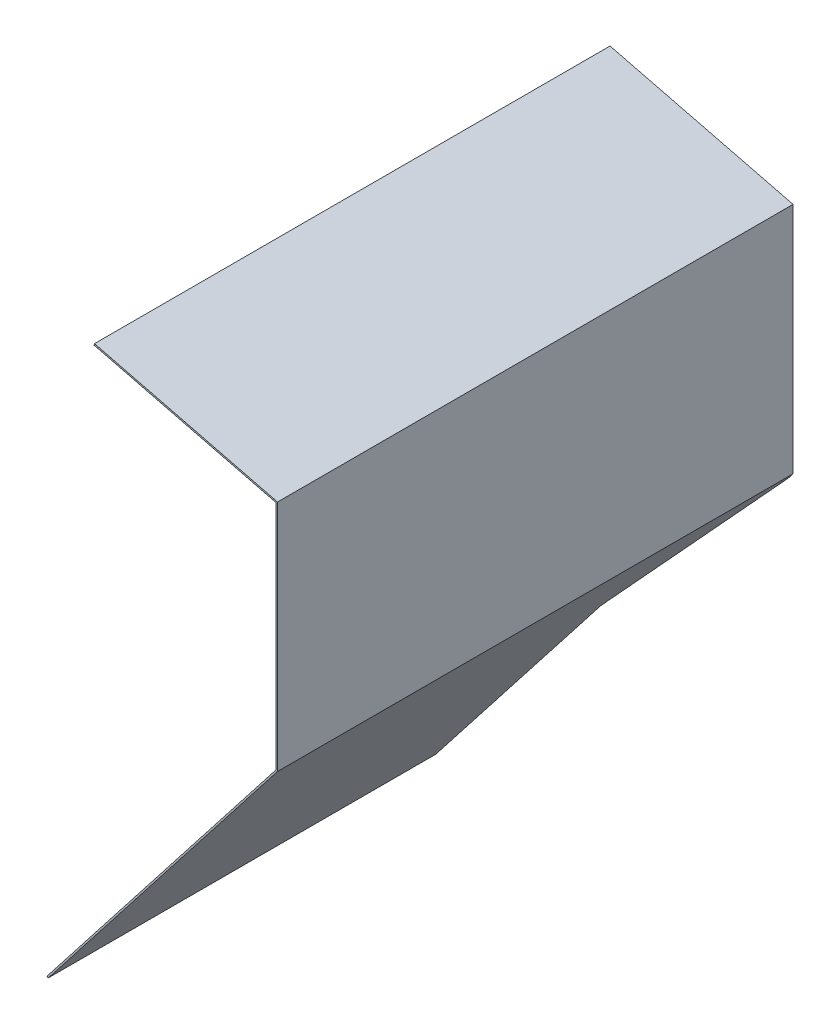
ISO-10303-21;
HEADER;
FILE_DESCRIPTION(('STEP AP214'),'2;1');
FILE_NAME('part.step','',(''),(''),'','','');
FILE_SCHEMA(('AUTOMOTIVE_DESIGN { 1 0 10303 214 1 1 1 1 }'));
ENDSEC;
DATA;
#1=APPLICATION_CONTEXT('core data for automotive mechanical design processes');
#2=APPLICATION_PROTOCOL_DEFINITION('international standard','automotive_design',2000,#1);
#3=PRODUCT_CONTEXT('',#1,'mechanical');
#4=PRODUCT('Part','Part','',(#3));
#5=PRODUCT_RELATED_PRODUCT_CATEGORY('part','',(#4));
#6=PRODUCT_DEFINITION_FORMATION('','',#4);
#7=PRODUCT_DEFINITION_CONTEXT('part definition',#1,'design');
#8=PRODUCT_DEFINITION('design','',#6,#7);
#9=PRODUCT_DEFINITION_SHAPE('','',#8);
#10=(LENGTH_UNIT() NAMED_UNIT(*) SI_UNIT(.MILLI.,.METRE.));
#11=(NAMED_UNIT(*) PLANE_ANGLE_UNIT() SI_UNIT($,.RADIAN.));
#12=(NAMED_UNIT(*) SI_UNIT($,.STERADIAN.) SOLID_ANGLE_UNIT());
#13=UNCERTAINTY_MEASURE_WITH_UNIT(LENGTH_MEASURE(1.E-05),#10,'distance_accuracy_value','');
#14=(GEOMETRIC_REPRESENTATION_CONTEXT(3) GLOBAL_UNCERTAINTY_ASSIGNED_CONTEXT((#13)) GLOBAL_UNIT_ASSIGNED_CONTEXT((#10,
#11,#12)) REPRESENTATION_CONTEXT('',''));
#15=CARTESIAN_POINT('',(0.,0.,0.));
#16=DIRECTION('',(0.,0.,1.));
#17=DIRECTION('',(1.,0.,0.));
#18=AXIS2_PLACEMENT_3D('',#15,#16,#17);
#19=CARTESIAN_POINT('',(-659.8860864691,205.547403961,96.631033194003));
#20=DIRECTION('',(0.,0.,1.));
#21=DIRECTION('',(1.,0.,0.));
#22=AXIS2_PLACEMENT_3D('',#19,#20,#21);
#23=PLANE('',#22);
#24=DIRECTION('',(0.78801075360678,-0.615661475325584,0.));
#25=VECTOR('',#24,1.);
#26=CARTESIAN_POINT('',(-867.974269009,-57.5447855479998,96.631033194003));
#27=LINE('',#26,#25);
#28=CARTESIAN_POINT('',(-867.974269009,-57.5447855479998,96.631033194003));
#29=VERTEX_POINT('',#28);
#30=CARTESIAN_POINT('',(-866.3982475018,-58.7761084979999,96.631033194003));
#31=VERTEX_POINT('',#30);
#32=EDGE_CURVE('E187',#29,#31,#27,.T.);
#33=ORIENTED_EDGE('',*,*,#32,.F.);
#34=DIRECTION('',(-0.615661475325695,-0.788010753606693,0.));
#35=VECTOR('',#34,1.);
#36=CARTESIAN_POINT('',(-661.4621079763,206.778726912,96.631033194003));
#37=LINE('',#36,#35);
#38=CARTESIAN_POINT('',(-661.4621079763,206.778726912,96.631033194003));
#39=VERTEX_POINT('',#38);
#40=EDGE_CURVE('E42',#39,#29,#37,.T.);
#41=ORIENTED_EDGE('',*,*,#40,.F.);
#42=DIRECTION('',(-0.788010753606742,0.615661475325633,0.));
#43=VECTOR('',#42,1.);
#44=CARTESIAN_POINT('',(-659.8860864691,205.547403961,96.631033194003));
#45=LINE('',#44,#43);
#46=CARTESIAN_POINT('',(-659.8860864691,205.547403961,96.631033194003));
#47=VERTEX_POINT('',#46);
#48=EDGE_CURVE('E165',#47,#39,#45,.T.);
#49=ORIENTED_EDGE('',*,*,#48,.F.);
#50=DIRECTION('',(0.615661475325695,0.788010753606693,0.));
#51=VECTOR('',#50,1.);
#52=CARTESIAN_POINT('',(-866.3982475018,-58.7761084979999,96.631033194003));
#53=LINE('',#52,#51);
#54=EDGE_CURVE('E196',#31,#47,#53,.T.);
#55=ORIENTED_EDGE('',*,*,#54,.F.);
#56=EDGE_LOOP('',(#33,#41,#49,#55));
#57=FACE_BOUND('',#56,.T.);
#58=ADVANCED_FACE('F17',(#57),#23,.F.);
#59=CARTESIAN_POINT('',(-866.3982475018,-58.7761084979999,-63.3689668059969));
#60=DIRECTION('',(0.788010753606693,-0.615661475325695,0.));
#61=DIRECTION('',(0.,0.,-1.));
#62=AXIS2_PLACEMENT_3D('',#59,#60,#61);
#63=PLANE('',#62);
#64=DIRECTION('',(-0.370514325026901,-0.474236709925902,0.798635510047303));
#65=VECTOR('',#64,1.);
#66=CARTESIAN_POINT('',(-585.6566147533,300.556795146,-63.3689668059969));
#67=LINE('',#66,#65);
#68=CARTESIAN_POINT('',(-585.6566147533,300.556795146,-63.3689668059969));
#69=VERTEX_POINT('',#68);
#70=EDGE_CURVE('E61',#69,#47,#67,.T.);
#71=ORIENTED_EDGE('',*,*,#70,.F.);
#72=DIRECTION('',(0.615661475325695,0.788010753606694,0.));
#73=VECTOR('',#72,1.);
#74=CARTESIAN_POINT('',(-585.6566147533,300.556795146,-63.3689668059969));
#75=LINE('',#74,#73);
#76=CARTESIAN_POINT('',(-579.5,308.436902682,-63.3689668059969));
#77=VERTEX_POINT('',#76);
#78=EDGE_CURVE('E11',#69,#77,#75,.T.);
#79=ORIENTED_EDGE('',*,*,#78,.T.);
#80=DIRECTION('',(0.,0.,1.));
#81=VECTOR('',#80,1.);
#82=CARTESIAN_POINT('',(-579.5,308.436902682,-63.3689668059969));
#83=LINE('',#82,#81);
#84=CARTESIAN_POINT('',(-579.5,308.436902682,581.631033194003));
#85=VERTEX_POINT('',#84);
#86=EDGE_CURVE('E28',#77,#85,#83,.T.);
#87=ORIENTED_EDGE('',*,*,#86,.T.);
#88=DIRECTION('',(0.615661475325695,0.788010753606693,0.));
#89=VECTOR('',#88,1.);
#90=CARTESIAN_POINT('',(-866.3982475018,-58.7761084979998,581.631033194003));
#91=LINE('',#90,#89);
#92=CARTESIAN_POINT('',(-866.3982475018,-58.7761084979998,581.631033194003));
#93=VERTEX_POINT('',#92);
#94=EDGE_CURVE('E160',#93,#85,#91,.T.);
#95=ORIENTED_EDGE('',*,*,#94,.F.);
#96=DIRECTION('',(0.,0.,1.));
#97=VECTOR('',#96,1.);
#98=CARTESIAN_POINT('',(-866.3982475018,-58.7761084979999,96.631033194003));
#99=LINE('',#98,#97);
#100=EDGE_CURVE('E190',#31,#93,#99,.T.);
#101=ORIENTED_EDGE('',*,*,#100,.F.);
#102=ORIENTED_EDGE('',*,*,#54,.T.);
#103=EDGE_LOOP('',(#71,#79,#87,#95,#101,#102));
#104=FACE_BOUND('',#103,.T.);
#105=ADVANCED_FACE('F247',(#104),#63,.T.);
#106=CARTESIAN_POINT('',(-867.974269009,-57.5447855479998,-63.3689668059969));
#107=DIRECTION('',(-0.615661475325695,-0.788010753606693,0.));
#108=DIRECTION('',(0.,0.,1.));
#109=AXIS2_PLACEMENT_3D('',#106,#107,#108);
#110=PLANE('',#109);
#111=ORIENTED_EDGE('',*,*,#100,.T.);
#112=DIRECTION('',(0.78801075360678,-0.615661475325584,0.));
#113=VECTOR('',#112,1.);
#114=CARTESIAN_POINT('',(-867.974269009,-57.5447855479998,581.631033194003));
#115=LINE('',#114,#113);
#116=CARTESIAN_POINT('',(-867.974269009,-57.5447855479998,581.631033194003));
#117=VERTEX_POINT('',#116);
#118=EDGE_CURVE('E171',#117,#93,#115,.T.);
#119=ORIENTED_EDGE('',*,*,#118,.F.);
#120=DIRECTION('',(0.,0.,1.));
#121=VECTOR('',#120,1.);
#122=CARTESIAN_POINT('',(-867.974269009,-57.5447855479998,96.631033194003));
#123=LINE('',#122,#121);
#124=EDGE_CURVE('E180',#29,#117,#123,.T.);
#125=ORIENTED_EDGE('',*,*,#124,.F.);
#126=ORIENTED_EDGE('',*,*,#32,.T.);
#127=EDGE_LOOP('',(#111,#119,#125,#126));
#128=FACE_BOUND('',#127,.T.);
#129=ADVANCED_FACE('F238',(#128),#110,.T.);
#130=CARTESIAN_POINT('',(-581.5,309.125557909,-63.3689668059969));
#131=DIRECTION('',(-0.788010753606693,0.615661475325695,0.));
#132=DIRECTION('',(-0.615661475325695,-0.788010753606693,0.));
#133=AXIS2_PLACEMENT_3D('',#130,#131,#132);
#134=PLANE('',#133);
#135=ORIENTED_EDGE('',*,*,#124,.T.);
#136=DIRECTION('',(-0.615661475325695,-0.788010753606693,0.));
#137=VECTOR('',#136,1.);
#138=CARTESIAN_POINT('',(-581.5,309.125557909,581.631033194003));
#139=LINE('',#138,#137);
#140=CARTESIAN_POINT('',(-581.5,309.125557909,581.631033194003));
#141=VERTEX_POINT('',#140);
#142=EDGE_CURVE('E137',#141,#117,#139,.T.);
#143=ORIENTED_EDGE('',*,*,#142,.F.);
#144=DIRECTION('',(0.,0.,1.));
#145=VECTOR('',#144,1.);
#146=CARTESIAN_POINT('',(-581.5,309.125557909,-63.3689668059969));
#147=LINE('',#146,#145);
#148=CARTESIAN_POINT('',(-581.5,309.125557909,-63.3689668059969));
#149=VERTEX_POINT('',#148);
#150=EDGE_CURVE('E132',#149,#141,#147,.T.);
#151=ORIENTED_EDGE('',*,*,#150,.F.);
#152=DIRECTION('',(-0.615661475325695,-0.788010753606694,0.));
#153=VECTOR('',#152,1.);
#154=CARTESIAN_POINT('',(-581.5,309.125557909,-63.3689668059969));
#155=LINE('',#154,#153);
#156=CARTESIAN_POINT('',(-587.2326362605,301.788118097,-63.3689668059969));
#157=VERTEX_POINT('',#156);
#158=EDGE_CURVE('E177',#149,#157,#155,.T.);
#159=ORIENTED_EDGE('',*,*,#158,.T.);
#160=DIRECTION('',(-0.370514325026901,-0.474236709925902,0.798635510047303));
#161=VECTOR('',#160,1.);
#162=CARTESIAN_POINT('',(-587.2326362605,301.788118097,-63.3689668059969));
#163=LINE('',#162,#161);
#164=EDGE_CURVE('E174',#157,#39,#163,.T.);
#165=ORIENTED_EDGE('',*,*,#164,.T.);
#166=ORIENTED_EDGE('',*,*,#40,.T.);
#167=EDGE_LOOP('',(#135,#143,#151,#159,#165,#166));
#168=FACE_BOUND('',#167,.T.);
#169=ADVANCED_FACE('F240',(#168),#134,.T.);
#170=CARTESIAN_POINT('',(-585.6566147533,300.556795146,-63.3689668059969));
#171=DIRECTION('',(0.491689116363195,0.629333370129494,0.601815023151994));
#172=DIRECTION('',(-0.788010753606728,0.61566147532565,0.));
#173=AXIS2_PLACEMENT_3D('',#170,#171,#172);
#174=PLANE('',#173);
#175=ORIENTED_EDGE('',*,*,#70,.T.);
#176=ORIENTED_EDGE('',*,*,#48,.T.);
#177=ORIENTED_EDGE('',*,*,#164,.F.);
#178=DIRECTION('',(0.788010753606693,-0.615661475325695,0.));
#179=VECTOR('',#178,1.);
#180=CARTESIAN_POINT('',(-587.2326362605,301.788118097,-63.3689668059969));
#181=LINE('',#180,#179);
#182=EDGE_CURVE('E168',#157,#69,#181,.T.);
#183=ORIENTED_EDGE('',*,*,#182,.T.);
#184=EDGE_LOOP('',(#175,#176,#177,#183));
#185=FACE_BOUND('',#184,.T.);
#186=ADVANCED_FACE('F225',(#185),#174,.F.);
#187=CARTESIAN_POINT('',(-579.5,454.436902682,-63.3689668059969));
#188=DIRECTION('',(0.,0.,1.));
#189=DIRECTION('',(1.,0.,0.));
#190=AXIS2_PLACEMENT_3D('',#187,#188,#189);
#191=PLANE('',#190);
#192=ORIENTED_EDGE('',*,*,#158,.F.);
#193=DIRECTION('',(0.,-1.,0.));
#194=VECTOR('',#193,1.);
#195=CARTESIAN_POINT('',(-581.5,598.874331429,-63.368966805997));
#196=LINE('',#195,#194);
#197=CARTESIAN_POINT('',(-581.5,598.874331429,-63.368966805997));
#198=VERTEX_POINT('',#197);
#199=EDGE_CURVE('E150',#198,#149,#196,.T.);
#200=ORIENTED_EDGE('',*,*,#199,.F.);
#201=DIRECTION('',(0.970295726275989,-0.241921895599698,0.));
#202=VECTOR('',#201,1.);
#203=CARTESIAN_POINT('',(-808.9736351923,655.589878591,-63.368966805997));
#204=LINE('',#203,#202);
#205=CARTESIAN_POINT('',(-808.9736351923,655.589878591,-63.368966805997));
#206=VERTEX_POINT('',#205);
#207=EDGE_CURVE('E147',#206,#198,#204,.T.);
#208=ORIENTED_EDGE('',*,*,#207,.F.);
#209=DIRECTION('',(-0.241921895599698,-0.970295726275989,0.));
#210=VECTOR('',#209,1.);
#211=CARTESIAN_POINT('',(-808.4897914011,657.530470044,-63.368966805997));
#212=LINE('',#211,#210);
#213=CARTESIAN_POINT('',(-808.4897914011,657.530470044,-63.368966805997));
#214=VERTEX_POINT('',#213);
#215=EDGE_CURVE('E161',#214,#206,#212,.T.);
#216=ORIENTED_EDGE('',*,*,#215,.F.);
#217=DIRECTION('',(-0.970295726275989,0.241921895599698,0.));
#218=VECTOR('',#217,1.);
#219=CARTESIAN_POINT('',(-579.5,600.436902682,-63.368966805997));
#220=LINE('',#219,#218);
#221=CARTESIAN_POINT('',(-579.5,600.436902682,-63.368966805997));
#222=VERTEX_POINT('',#221);
#223=EDGE_CURVE('E185',#222,#214,#220,.T.);
#224=ORIENTED_EDGE('',*,*,#223,.F.);
#225=DIRECTION('',(0.,1.,0.));
#226=VECTOR('',#225,1.);
#227=CARTESIAN_POINT('',(-579.5,308.436902682,-63.3689668059969));
#228=LINE('',#227,#226);
#229=EDGE_CURVE('E210',#77,#222,#228,.T.);
#230=ORIENTED_EDGE('',*,*,#229,.F.);
#231=ORIENTED_EDGE('',*,*,#78,.F.);
#232=ORIENTED_EDGE('',*,*,#182,.F.);
#233=EDGE_LOOP('',(#192,#200,#208,#216,#224,#230,#231,#232));
#234=FACE_BOUND('',#233,.T.);
#235=ADVANCED_FACE('F244',(#234),#191,.F.);
#236=CARTESIAN_POINT('',(-579.5,308.436902682,-63.3689668059969));
#237=DIRECTION('',(1.,0.,0.));
#238=DIRECTION('',(0.,0.,1.));
#239=AXIS2_PLACEMENT_3D('',#236,#237,#238);
#240=PLANE('',#239);
#241=DIRECTION('',(0.,0.,1.));
#242=VECTOR('',#241,1.);
#243=CARTESIAN_POINT('',(-579.5,600.436902682,-63.368966805997));
#244=LINE('',#243,#242);
#245=CARTESIAN_POINT('',(-579.5,600.436902682,581.631033194003));
#246=VERTEX_POINT('',#245);
#247=EDGE_CURVE('E21',#222,#246,#244,.T.);
#248=ORIENTED_EDGE('',*,*,#247,.T.);
#249=DIRECTION('',(0.,1.,0.));
#250=VECTOR('',#249,1.);
#251=CARTESIAN_POINT('',(-579.5,308.436902682,581.631033194003));
#252=LINE('',#251,#250);
#253=EDGE_CURVE('E205',#85,#246,#252,.T.);
#254=ORIENTED_EDGE('',*,*,#253,.F.);
#255=ORIENTED_EDGE('',*,*,#86,.F.);
#256=ORIENTED_EDGE('',*,*,#229,.T.);
#257=EDGE_LOOP('',(#248,#254,#255,#256));
#258=FACE_BOUND('',#257,.T.);
#259=ADVANCED_FACE('F249',(#258),#240,.T.);
#260=CARTESIAN_POINT('',(-579.5,454.436902682,581.631033194003));
#261=DIRECTION('',(0.,0.,1.));
#262=DIRECTION('',(1.,0.,0.));
#263=AXIS2_PLACEMENT_3D('',#260,#261,#262);
#264=PLANE('',#263);
#265=ORIENTED_EDGE('',*,*,#253,.T.);
#266=DIRECTION('',(-0.970295726275989,0.241921895599698,0.));
#267=VECTOR('',#266,1.);
#268=CARTESIAN_POINT('',(-579.5,600.436902682,581.631033194003));
#269=LINE('',#268,#267);
#270=CARTESIAN_POINT('',(-808.4897914011,657.530470044,581.631033194003));
#271=VERTEX_POINT('',#270);
#272=EDGE_CURVE('E184',#246,#271,#269,.T.);
#273=ORIENTED_EDGE('',*,*,#272,.T.);
#274=DIRECTION('',(-0.241921895599698,-0.970295726275989,0.));
#275=VECTOR('',#274,1.);
#276=CARTESIAN_POINT('',(-808.4897914011,657.530470044,581.631033194003));
#277=LINE('',#276,#275);
#278=CARTESIAN_POINT('',(-808.9736351923,655.589878591,581.631033194003));
#279=VERTEX_POINT('',#278);
#280=EDGE_CURVE('E141',#271,#279,#277,.T.);
#281=ORIENTED_EDGE('',*,*,#280,.T.);
#282=DIRECTION('',(0.970295726275989,-0.241921895599698,0.));
#283=VECTOR('',#282,1.);
#284=CARTESIAN_POINT('',(-808.9736351923,655.589878591,581.631033194003));
#285=LINE('',#284,#283);
#286=CARTESIAN_POINT('',(-581.5,598.874331429,581.631033194003));
#287=VERTEX_POINT('',#286);
#288=EDGE_CURVE('E121',#279,#287,#285,.T.);
#289=ORIENTED_EDGE('',*,*,#288,.T.);
#290=DIRECTION('',(0.,-1.,0.));
#291=VECTOR('',#290,1.);
#292=CARTESIAN_POINT('',(-581.5,598.874331429,581.631033194003));
#293=LINE('',#292,#291);
#294=EDGE_CURVE('E128',#287,#141,#293,.T.);
#295=ORIENTED_EDGE('',*,*,#294,.T.);
#296=ORIENTED_EDGE('',*,*,#142,.T.);
#297=ORIENTED_EDGE('',*,*,#118,.T.);
#298=ORIENTED_EDGE('',*,*,#94,.T.);
#299=EDGE_LOOP('',(#265,#273,#281,#289,#295,#296,#297,#298));
#300=FACE_BOUND('',#299,.T.);
#301=ADVANCED_FACE('F139',(#300),#264,.T.);
#302=CARTESIAN_POINT('',(-581.5,598.874331429,-63.368966805997));
#303=DIRECTION('',(-1.,0.,0.));
#304=DIRECTION('',(0.,-1.,0.));
#305=AXIS2_PLACEMENT_3D('',#302,#303,#304);
#306=PLANE('',#305);
#307=ORIENTED_EDGE('',*,*,#150,.T.);
#308=ORIENTED_EDGE('',*,*,#294,.F.);
#309=DIRECTION('',(0.,0.,1.));
#310=VECTOR('',#309,1.);
#311=CARTESIAN_POINT('',(-581.5,598.874331429,-63.368966805997));
#312=LINE('',#311,#310);
#313=EDGE_CURVE('E130',#198,#287,#312,.T.);
#314=ORIENTED_EDGE('',*,*,#313,.F.);
#315=ORIENTED_EDGE('',*,*,#199,.T.);
#316=EDGE_LOOP('',(#307,#308,#314,#315));
#317=FACE_BOUND('',#316,.T.);
#318=ADVANCED_FACE('F19',(#317),#306,.T.);
#319=CARTESIAN_POINT('',(-808.9736351923,655.589878591,-63.368966805997));
#320=DIRECTION('',(-0.241921895599698,-0.970295726275989,0.));
#321=DIRECTION('',(0.,0.,1.));
#322=AXIS2_PLACEMENT_3D('',#319,#320,#321);
#323=PLANE('',#322);
#324=ORIENTED_EDGE('',*,*,#313,.T.);
#325=ORIENTED_EDGE('',*,*,#288,.F.);
#326=DIRECTION('',(0.,0.,1.));
#327=VECTOR('',#326,1.);
#328=CARTESIAN_POINT('',(-808.9736351923,655.589878591,-63.368966805997));
#329=LINE('',#328,#327);
#330=EDGE_CURVE('E155',#206,#279,#329,.T.);
#331=ORIENTED_EDGE('',*,*,#330,.F.);
#332=ORIENTED_EDGE('',*,*,#207,.T.);
#333=EDGE_LOOP('',(#324,#325,#331,#332));
#334=FACE_BOUND('',#333,.T.);
#335=ADVANCED_FACE('F145',(#334),#323,.T.);
#336=CARTESIAN_POINT('',(-808.4897914011,657.530470044,-63.368966805997));
#337=DIRECTION('',(-0.970295726275989,0.241921895599698,0.));
#338=DIRECTION('',(-0.241921895599698,-0.970295726275989,0.));
#339=AXIS2_PLACEMENT_3D('',#336,#337,#338);
#340=PLANE('',#339);
#341=ORIENTED_EDGE('',*,*,#330,.T.);
#342=ORIENTED_EDGE('',*,*,#280,.F.);
#343=DIRECTION('',(0.,0.,1.));
#344=VECTOR('',#343,1.);
#345=CARTESIAN_POINT('',(-808.4897914011,657.530470044,-63.368966805997));
#346=LINE('',#345,#344);
#347=EDGE_CURVE('E164',#214,#271,#346,.T.);
#348=ORIENTED_EDGE('',*,*,#347,.F.);
#349=ORIENTED_EDGE('',*,*,#215,.T.);
#350=EDGE_LOOP('',(#341,#342,#348,#349));
#351=FACE_BOUND('',#350,.T.);
#352=ADVANCED_FACE('F257',(#351),#340,.T.);
#353=CARTESIAN_POINT('',(-579.5,600.436902682,-63.368966805997));
#354=DIRECTION('',(0.241921895599698,0.970295726275989,0.));
#355=DIRECTION('',(0.,0.,-1.));
#356=AXIS2_PLACEMENT_3D('',#353,#354,#355);
#357=PLANE('',#356);
#358=ORIENTED_EDGE('',*,*,#347,.T.);
#359=ORIENTED_EDGE('',*,*,#272,.F.);
#360=ORIENTED_EDGE('',*,*,#247,.F.);
#361=ORIENTED_EDGE('',*,*,#223,.T.);
#362=EDGE_LOOP('',(#358,#359,#360,#361));
#363=FACE_BOUND('',#362,.T.);
#364=ADVANCED_FACE('F254',(#363),#357,.T.);
#365=CLOSED_SHELL('',(#58,#105,#129,#169,#186,#235,#259,#301,#318,#335,#352,#364));
#366=MANIFOLD_SOLID_BREP('B1',#365);
#367=ADVANCED_BREP_SHAPE_REPRESENTATION('',(#18,#366),#14);
#368=SHAPE_DEFINITION_REPRESENTATION(#9,#367);
ENDSEC;
END-ISO-10303-21;
